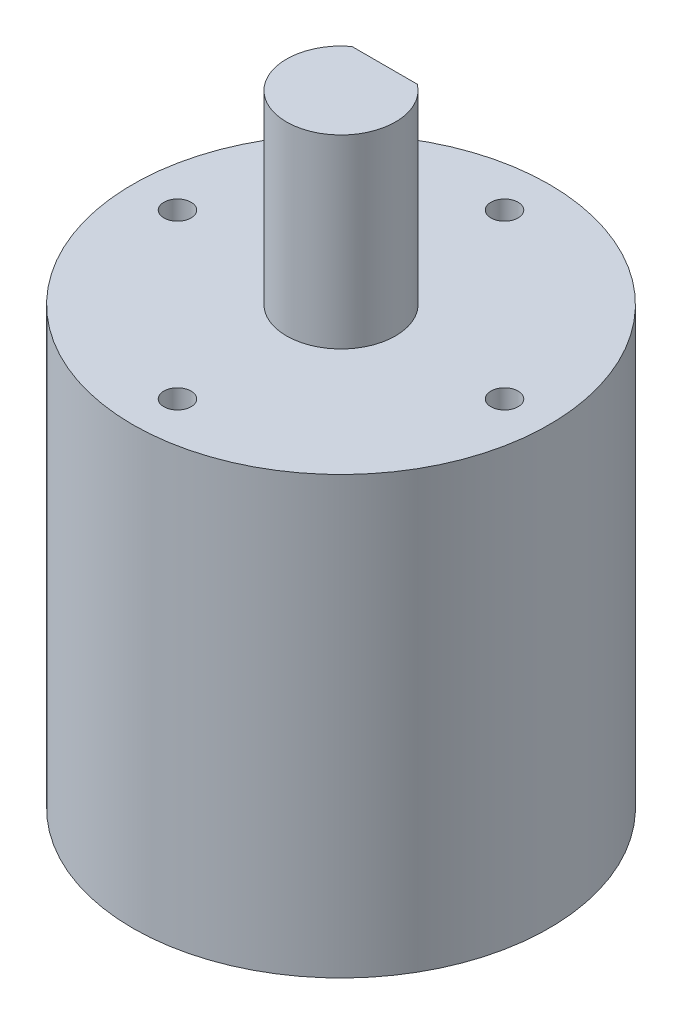
ISO-10303-21;
HEADER;
FILE_DESCRIPTION(('STEP AP214'),'2;1');
FILE_NAME('part.step','',(''),(''),'','','');
FILE_SCHEMA(('AUTOMOTIVE_DESIGN { 1 0 10303 214 1 1 1 1 }'));
ENDSEC;
DATA;
#1=APPLICATION_CONTEXT('core data for automotive mechanical design processes');
#2=APPLICATION_PROTOCOL_DEFINITION('international standard','automotive_design',2000,#1);
#3=PRODUCT_CONTEXT('',#1,'mechanical');
#4=PRODUCT('Part','Part','',(#3));
#5=PRODUCT_RELATED_PRODUCT_CATEGORY('part','',(#4));
#6=PRODUCT_DEFINITION_FORMATION('','',#4);
#7=PRODUCT_DEFINITION_CONTEXT('part definition',#1,'design');
#8=PRODUCT_DEFINITION('design','',#6,#7);
#9=PRODUCT_DEFINITION_SHAPE('','',#8);
#10=(LENGTH_UNIT() NAMED_UNIT(*) SI_UNIT(.MILLI.,.METRE.));
#11=(NAMED_UNIT(*) PLANE_ANGLE_UNIT() SI_UNIT($,.RADIAN.));
#12=(NAMED_UNIT(*) SI_UNIT($,.STERADIAN.) SOLID_ANGLE_UNIT());
#13=UNCERTAINTY_MEASURE_WITH_UNIT(LENGTH_MEASURE(1.E-05),#10,'distance_accuracy_value','');
#14=(GEOMETRIC_REPRESENTATION_CONTEXT(3) GLOBAL_UNCERTAINTY_ASSIGNED_CONTEXT((#13)) GLOBAL_UNIT_ASSIGNED_CONTEXT((#10,
#11,#12)) REPRESENTATION_CONTEXT('',''));
#15=CARTESIAN_POINT('',(0.,0.,0.));
#16=DIRECTION('',(0.,0.,1.));
#17=DIRECTION('',(1.,0.,0.));
#18=AXIS2_PLACEMENT_3D('',#15,#16,#17);
#19=CARTESIAN_POINT('',(0.,40.,0.));
#20=DIRECTION('',(0.,-1.,0.));
#21=DIRECTION('',(0.,0.,-1.));
#22=AXIS2_PLACEMENT_3D('',#19,#20,#21);
#23=CYLINDRICAL_SURFACE('',#22,19.1);
#24=CARTESIAN_POINT('',(0.,40.,0.));
#25=DIRECTION('',(0.,1.,0.));
#26=DIRECTION('',(0.,0.,1.));
#27=AXIS2_PLACEMENT_3D('',#24,#25,#26);
#28=CIRCLE('',#27,19.1);
#29=CARTESIAN_POINT('',(0.,40.,19.1));
#30=VERTEX_POINT('',#29);
#31=EDGE_CURVE('E46',#30,#30,#28,.T.);
#32=ORIENTED_EDGE('',*,*,#31,.F.);
#33=EDGE_LOOP('',(#32));
#34=FACE_BOUND('',#33,.T.);
#35=CARTESIAN_POINT('',(0.,0.,0.));
#36=DIRECTION('',(0.,1.,0.));
#37=DIRECTION('',(0.,0.,1.));
#38=AXIS2_PLACEMENT_3D('',#35,#36,#37);
#39=CIRCLE('',#38,19.1);
#40=CARTESIAN_POINT('',(0.,0.,19.1));
#41=VERTEX_POINT('',#40);
#42=EDGE_CURVE('E41',#41,#41,#39,.T.);
#43=ORIENTED_EDGE('',*,*,#42,.T.);
#44=EDGE_LOOP('',(#43));
#45=FACE_BOUND('',#44,.T.);
#46=ADVANCED_FACE('F38',(#34,#45),#23,.T.);
#47=CARTESIAN_POINT('',(0.,40.,0.));
#48=DIRECTION('',(0.,1.,0.));
#49=DIRECTION('',(0.,0.,1.));
#50=AXIS2_PLACEMENT_3D('',#47,#48,#49);
#51=PLANE('',#50);
#52=CARTESIAN_POINT('',(0.,40.,-15.));
#53=DIRECTION('',(0.,1.,0.));
#54=DIRECTION('',(0.,0.,1.));
#55=AXIS2_PLACEMENT_3D('',#52,#53,#54);
#56=CIRCLE('',#55,1.25);
#57=CARTESIAN_POINT('',(0.,40.,-13.75));
#58=VERTEX_POINT('',#57);
#59=EDGE_CURVE('E91',#58,#58,#56,.T.);
#60=ORIENTED_EDGE('',*,*,#59,.F.);
#61=EDGE_LOOP('',(#60));
#62=FACE_BOUND('',#61,.T.);
#63=CARTESIAN_POINT('',(-14.9999999999996,40.,4.2632564145606E-13));
#64=DIRECTION('',(0.,1.,0.));
#65=DIRECTION('',(0.,0.,1.));
#66=AXIS2_PLACEMENT_3D('',#63,#64,#65);
#67=CIRCLE('',#66,1.25);
#68=CARTESIAN_POINT('',(-14.9999999999996,40.,1.25000000000043));
#69=VERTEX_POINT('',#68);
#70=EDGE_CURVE('E90',#69,#69,#67,.T.);
#71=ORIENTED_EDGE('',*,*,#70,.F.);
#72=EDGE_LOOP('',(#71));
#73=FACE_BOUND('',#72,.T.);
#74=CARTESIAN_POINT('',(15.0000000000004,40.,-4.24488671257339E-13));
#75=DIRECTION('',(0.,1.,0.));
#76=DIRECTION('',(0.,0.,1.));
#77=AXIS2_PLACEMENT_3D('',#74,#75,#76);
#78=CIRCLE('',#77,1.25);
#79=CARTESIAN_POINT('',(15.0000000000004,40.,1.24999999999958));
#80=VERTEX_POINT('',#79);
#81=EDGE_CURVE('E101',#80,#80,#78,.T.);
#82=ORIENTED_EDGE('',*,*,#81,.F.);
#83=EDGE_LOOP('',(#82));
#84=FACE_BOUND('',#83,.T.);
#85=CARTESIAN_POINT('',(8.48977342514678E-13,40.,15.));
#86=DIRECTION('',(0.,1.,0.));
#87=DIRECTION('',(0.,0.,1.));
#88=AXIS2_PLACEMENT_3D('',#85,#86,#87);
#89=CIRCLE('',#88,1.25);
#90=CARTESIAN_POINT('',(8.48977342514678E-13,40.,16.25));
#91=VERTEX_POINT('',#90);
#92=EDGE_CURVE('E107',#91,#91,#89,.T.);
#93=ORIENTED_EDGE('',*,*,#92,.F.);
#94=EDGE_LOOP('',(#93));
#95=FACE_BOUND('',#94,.T.);
#96=CARTESIAN_POINT('',(0.,40.,0.));
#97=DIRECTION('',(0.,1.,0.));
#98=DIRECTION('',(0.,0.,1.));
#99=AXIS2_PLACEMENT_3D('',#96,#97,#98);
#100=CIRCLE('',#99,5.);
#101=CARTESIAN_POINT('',(0.,40.,5.));
#102=VERTEX_POINT('',#101);
#103=EDGE_CURVE('E11',#102,#102,#100,.T.);
#104=ORIENTED_EDGE('',*,*,#103,.F.);
#105=EDGE_LOOP('',(#104));
#106=FACE_BOUND('',#105,.T.);
#107=ORIENTED_EDGE('',*,*,#31,.T.);
#108=EDGE_LOOP('',(#107));
#109=FACE_BOUND('',#108,.T.);
#110=ADVANCED_FACE('F132',(#62,#73,#84,#95,#106,#109),#51,.T.);
#111=CARTESIAN_POINT('',(0.,0.,0.));
#112=DIRECTION('',(0.,1.,0.));
#113=DIRECTION('',(0.,0.,1.));
#114=AXIS2_PLACEMENT_3D('',#111,#112,#113);
#115=PLANE('',#114);
#116=ORIENTED_EDGE('',*,*,#42,.F.);
#117=EDGE_LOOP('',(#116));
#118=FACE_BOUND('',#117,.T.);
#119=ADVANCED_FACE('F129',(#118),#115,.F.);
#120=CARTESIAN_POINT('',(0.,57.,0.));
#121=DIRECTION('',(0.,-1.,0.));
#122=DIRECTION('',(0.,0.,-1.));
#123=AXIS2_PLACEMENT_3D('',#120,#121,#122);
#124=CYLINDRICAL_SURFACE('',#123,5.);
#125=CARTESIAN_POINT('',(0.,57.,0.));
#126=DIRECTION('',(0.,1.,0.));
#127=DIRECTION('',(0.,0.,1.));
#128=AXIS2_PLACEMENT_3D('',#125,#126,#127);
#129=CIRCLE('',#128,5.);
#130=CARTESIAN_POINT('',(-3.,57.,-4.));
#131=VERTEX_POINT('',#130);
#132=CARTESIAN_POINT('',(3.,57.,-4.));
#133=VERTEX_POINT('',#132);
#134=EDGE_CURVE('E119',#131,#133,#129,.T.);
#135=ORIENTED_EDGE('',*,*,#134,.F.);
#136=DIRECTION('',(0.,1.,0.));
#137=VECTOR('',#136,1.);
#138=CARTESIAN_POINT('',(-3.,42.,-4.));
#139=LINE('',#138,#137);
#140=CARTESIAN_POINT('',(-3.,42.,-4.));
#141=VERTEX_POINT('',#140);
#142=EDGE_CURVE('E54',#141,#131,#139,.T.);
#143=ORIENTED_EDGE('',*,*,#142,.F.);
#144=CARTESIAN_POINT('',(0.,42.,0.));
#145=DIRECTION('',(0.,1.,0.));
#146=DIRECTION('',(0.,0.,1.));
#147=AXIS2_PLACEMENT_3D('',#144,#145,#146);
#148=CIRCLE('',#147,5.);
#149=CARTESIAN_POINT('',(3.,42.,-4.));
#150=VERTEX_POINT('',#149);
#151=EDGE_CURVE('E113',#150,#141,#148,.T.);
#152=ORIENTED_EDGE('',*,*,#151,.F.);
#153=DIRECTION('',(0.,1.,0.));
#154=VECTOR('',#153,1.);
#155=CARTESIAN_POINT('',(3.,42.,-4.));
#156=LINE('',#155,#154);
#157=EDGE_CURVE('E60',#150,#133,#156,.T.);
#158=ORIENTED_EDGE('',*,*,#157,.T.);
#159=EDGE_LOOP('',(#135,#143,#152,#158));
#160=FACE_BOUND('',#159,.T.);
#161=ORIENTED_EDGE('',*,*,#103,.T.);
#162=EDGE_LOOP('',(#161));
#163=FACE_BOUND('',#162,.T.);
#164=ADVANCED_FACE('F131',(#160,#163),#124,.T.);
#165=CARTESIAN_POINT('',(0.,57.,0.));
#166=DIRECTION('',(0.,1.,0.));
#167=DIRECTION('',(0.,0.,1.));
#168=AXIS2_PLACEMENT_3D('',#165,#166,#167);
#169=PLANE('',#168);
#170=DIRECTION('',(1.,0.,0.));
#171=VECTOR('',#170,1.);
#172=CARTESIAN_POINT('',(-3.,57.,-4.));
#173=LINE('',#172,#171);
#174=EDGE_CURVE('E67',#131,#133,#173,.T.);
#175=ORIENTED_EDGE('',*,*,#174,.F.);
#176=ORIENTED_EDGE('',*,*,#134,.T.);
#177=EDGE_LOOP('',(#175,#176));
#178=FACE_BOUND('',#177,.T.);
#179=ADVANCED_FACE('F137',(#178),#169,.T.);
#180=CARTESIAN_POINT('',(-3.,42.,-4.));
#181=DIRECTION('',(0.,0.,1.));
#182=DIRECTION('',(1.,0.,0.));
#183=AXIS2_PLACEMENT_3D('',#180,#181,#182);
#184=PLANE('',#183);
#185=ORIENTED_EDGE('',*,*,#174,.T.);
#186=ORIENTED_EDGE('',*,*,#157,.F.);
#187=DIRECTION('',(1.,0.,0.));
#188=VECTOR('',#187,1.);
#189=CARTESIAN_POINT('',(-3.,42.,-4.));
#190=LINE('',#189,#188);
#191=EDGE_CURVE('E115',#141,#150,#190,.T.);
#192=ORIENTED_EDGE('',*,*,#191,.F.);
#193=ORIENTED_EDGE('',*,*,#142,.T.);
#194=EDGE_LOOP('',(#185,#186,#192,#193));
#195=FACE_BOUND('',#194,.T.);
#196=ADVANCED_FACE('F253',(#195),#184,.F.);
#197=CARTESIAN_POINT('',(0.,42.,0.));
#198=DIRECTION('',(0.,1.,0.));
#199=DIRECTION('',(0.,0.,1.));
#200=AXIS2_PLACEMENT_3D('',#197,#198,#199);
#201=PLANE('',#200);
#202=ORIENTED_EDGE('',*,*,#151,.T.);
#203=ORIENTED_EDGE('',*,*,#191,.T.);
#204=EDGE_LOOP('',(#202,#203));
#205=FACE_BOUND('',#204,.T.);
#206=ADVANCED_FACE('F159',(#205),#201,.T.);
#207=CARTESIAN_POINT('',(8.48977342514678E-13,31.5,15.));
#208=DIRECTION('',(0.,1.,0.));
#209=DIRECTION('',(0.,0.,1.));
#210=AXIS2_PLACEMENT_3D('',#207,#208,#209);
#211=CONICAL_SURFACE('',#210,1.25,1.0471975511966);
#212=CARTESIAN_POINT('',(8.4671868041634E-13,30.778312163513,15.));
#213=VERTEX_POINT('',#212);
#214=VERTEX_LOOP('',#213);
#215=FACE_BOUND('',#214,.T.);
#216=CARTESIAN_POINT('',(8.48977342514678E-13,31.5,15.));
#217=DIRECTION('',(0.,1.,0.));
#218=DIRECTION('',(0.,0.,1.));
#219=AXIS2_PLACEMENT_3D('',#216,#217,#218);
#220=CIRCLE('',#219,1.25);
#221=CARTESIAN_POINT('',(8.48977342514678E-13,31.5,16.25));
#222=VERTEX_POINT('',#221);
#223=EDGE_CURVE('E110',#222,#222,#220,.T.);
#224=ORIENTED_EDGE('',*,*,#223,.T.);
#225=EDGE_LOOP('',(#224));
#226=FACE_BOUND('',#225,.T.);
#227=ADVANCED_FACE('F164',(#215,#226),#211,.F.);
#228=CARTESIAN_POINT('',(8.48977342514678E-13,40.,15.));
#229=DIRECTION('',(0.,1.,0.));
#230=DIRECTION('',(0.,0.,1.));
#231=AXIS2_PLACEMENT_3D('',#228,#229,#230);
#232=CYLINDRICAL_SURFACE('',#231,1.25);
#233=ORIENTED_EDGE('',*,*,#223,.F.);
#234=EDGE_LOOP('',(#233));
#235=FACE_BOUND('',#234,.T.);
#236=ORIENTED_EDGE('',*,*,#92,.T.);
#237=EDGE_LOOP('',(#236));
#238=FACE_BOUND('',#237,.T.);
#239=ADVANCED_FACE('F169',(#235,#238),#232,.F.);
#240=CARTESIAN_POINT('',(15.0000000000004,31.5,-4.24488671257339E-13));
#241=DIRECTION('',(0.,1.,0.));
#242=DIRECTION('',(0.,0.,1.));
#243=AXIS2_PLACEMENT_3D('',#240,#241,#242);
#244=CONICAL_SURFACE('',#243,1.25,1.0471975511966);
#245=CARTESIAN_POINT('',(15.0000000000004,30.778312163513,-4.24488671257339E-13));
#246=VERTEX_POINT('',#245);
#247=VERTEX_LOOP('',#246);
#248=FACE_BOUND('',#247,.T.);
#249=CARTESIAN_POINT('',(15.0000000000004,31.5,-4.24488671257339E-13));
#250=DIRECTION('',(0.,1.,0.));
#251=DIRECTION('',(0.,0.,1.));
#252=AXIS2_PLACEMENT_3D('',#249,#250,#251);
#253=CIRCLE('',#252,1.25);
#254=CARTESIAN_POINT('',(15.0000000000004,31.5,1.24999999999957));
#255=VERTEX_POINT('',#254);
#256=EDGE_CURVE('E104',#255,#255,#253,.T.);
#257=ORIENTED_EDGE('',*,*,#256,.T.);
#258=EDGE_LOOP('',(#257));
#259=FACE_BOUND('',#258,.T.);
#260=ADVANCED_FACE('F179',(#248,#259),#244,.F.);
#261=CARTESIAN_POINT('',(15.0000000000004,40.,-4.24488671257339E-13));
#262=DIRECTION('',(0.,1.,0.));
#263=DIRECTION('',(0.,0.,1.));
#264=AXIS2_PLACEMENT_3D('',#261,#262,#263);
#265=CYLINDRICAL_SURFACE('',#264,1.25);
#266=ORIENTED_EDGE('',*,*,#256,.F.);
#267=EDGE_LOOP('',(#266));
#268=FACE_BOUND('',#267,.T.);
#269=ORIENTED_EDGE('',*,*,#81,.T.);
#270=EDGE_LOOP('',(#269));
#271=FACE_BOUND('',#270,.T.);
#272=ADVANCED_FACE('F191',(#268,#271),#265,.F.);
#273=CARTESIAN_POINT('',(-14.9999999999996,31.5,4.2632564145606E-13));
#274=DIRECTION('',(0.,1.,0.));
#275=DIRECTION('',(0.,0.,1.));
#276=AXIS2_PLACEMENT_3D('',#273,#274,#275);
#277=CONICAL_SURFACE('',#276,1.25,1.0471975511966);
#278=CARTESIAN_POINT('',(-14.9999999999996,30.778312163513,4.2632564145606E-13));
#279=VERTEX_POINT('',#278);
#280=VERTEX_LOOP('',#279);
#281=FACE_BOUND('',#280,.T.);
#282=CARTESIAN_POINT('',(-14.9999999999996,31.5,4.2632564145606E-13));
#283=DIRECTION('',(0.,1.,0.));
#284=DIRECTION('',(0.,0.,1.));
#285=AXIS2_PLACEMENT_3D('',#282,#283,#284);
#286=CIRCLE('',#285,1.25);
#287=CARTESIAN_POINT('',(-14.9999999999996,31.5,1.25000000000042));
#288=VERTEX_POINT('',#287);
#289=EDGE_CURVE('E94',#288,#288,#286,.T.);
#290=ORIENTED_EDGE('',*,*,#289,.T.);
#291=EDGE_LOOP('',(#290));
#292=FACE_BOUND('',#291,.T.);
#293=ADVANCED_FACE('F201',(#281,#292),#277,.F.);
#294=CARTESIAN_POINT('',(-14.9999999999996,40.,4.2632564145606E-13));
#295=DIRECTION('',(0.,1.,0.));
#296=DIRECTION('',(0.,0.,1.));
#297=AXIS2_PLACEMENT_3D('',#294,#295,#296);
#298=CYLINDRICAL_SURFACE('',#297,1.25);
#299=ORIENTED_EDGE('',*,*,#289,.F.);
#300=EDGE_LOOP('',(#299));
#301=FACE_BOUND('',#300,.T.);
#302=ORIENTED_EDGE('',*,*,#70,.T.);
#303=EDGE_LOOP('',(#302));
#304=FACE_BOUND('',#303,.T.);
#305=ADVANCED_FACE('F84',(#301,#304),#298,.F.);
#306=CARTESIAN_POINT('',(0.,31.5,-15.));
#307=DIRECTION('',(0.,1.,0.));
#308=DIRECTION('',(0.,0.,1.));
#309=AXIS2_PLACEMENT_3D('',#306,#307,#308);
#310=CONICAL_SURFACE('',#309,1.25,1.0471975511966);
#311=CARTESIAN_POINT('',(0.,30.778312163513,-15.));
#312=VERTEX_POINT('',#311);
#313=VERTEX_LOOP('',#312);
#314=FACE_BOUND('',#313,.T.);
#315=CARTESIAN_POINT('',(0.,31.5,-15.));
#316=DIRECTION('',(0.,1.,0.));
#317=DIRECTION('',(0.,0.,1.));
#318=AXIS2_PLACEMENT_3D('',#315,#316,#317);
#319=CIRCLE('',#318,1.25);
#320=CARTESIAN_POINT('',(0.,31.5,-13.75));
#321=VERTEX_POINT('',#320);
#322=EDGE_CURVE('E88',#321,#321,#319,.T.);
#323=ORIENTED_EDGE('',*,*,#322,.T.);
#324=EDGE_LOOP('',(#323));
#325=FACE_BOUND('',#324,.T.);
#326=ADVANCED_FACE('F80',(#314,#325),#310,.F.);
#327=CARTESIAN_POINT('',(0.,40.,-15.));
#328=DIRECTION('',(0.,1.,0.));
#329=DIRECTION('',(0.,0.,1.));
#330=AXIS2_PLACEMENT_3D('',#327,#328,#329);
#331=CYLINDRICAL_SURFACE('',#330,1.25);
#332=ORIENTED_EDGE('',*,*,#322,.F.);
#333=EDGE_LOOP('',(#332));
#334=FACE_BOUND('',#333,.T.);
#335=ORIENTED_EDGE('',*,*,#59,.T.);
#336=EDGE_LOOP('',(#335));
#337=FACE_BOUND('',#336,.T.);
#338=ADVANCED_FACE('F83',(#334,#337),#331,.F.);
#339=CLOSED_SHELL('',(#46,#110,#119,#164,#179,#196,#206,#227,#239,#260,#272,#293,#305,#326,#338));
#340=MANIFOLD_SOLID_BREP('B2',#339);
#341=ADVANCED_BREP_SHAPE_REPRESENTATION('',(#18,#340),#14);
#342=SHAPE_DEFINITION_REPRESENTATION(#9,#341);
ENDSEC;
END-ISO-10303-21;
